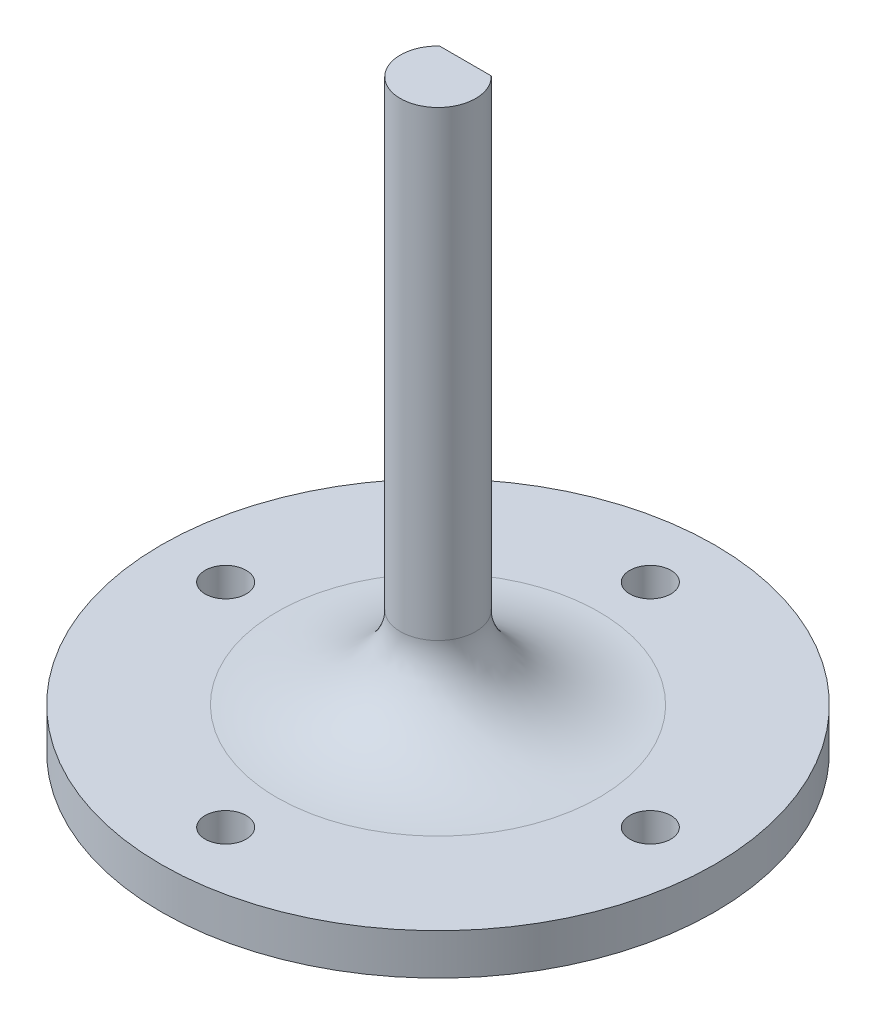
ISO-10303-21;
HEADER;
FILE_DESCRIPTION(('STEP AP214'),'2;1');
FILE_NAME('part.step','',(''),(''),'','','');
FILE_SCHEMA(('AUTOMOTIVE_DESIGN { 1 0 10303 214 1 1 1 1 }'));
ENDSEC;
DATA;
#1=APPLICATION_CONTEXT('core data for automotive mechanical design processes');
#2=APPLICATION_PROTOCOL_DEFINITION('international standard','automotive_design',2000,#1);
#3=PRODUCT_CONTEXT('',#1,'mechanical');
#4=PRODUCT('Part','Part','',(#3));
#5=PRODUCT_RELATED_PRODUCT_CATEGORY('part','',(#4));
#6=PRODUCT_DEFINITION_FORMATION('','',#4);
#7=PRODUCT_DEFINITION_CONTEXT('part definition',#1,'design');
#8=PRODUCT_DEFINITION('design','',#6,#7);
#9=PRODUCT_DEFINITION_SHAPE('','',#8);
#10=(LENGTH_UNIT() NAMED_UNIT(*) SI_UNIT(.MILLI.,.METRE.));
#11=(NAMED_UNIT(*) PLANE_ANGLE_UNIT() SI_UNIT($,.RADIAN.));
#12=(NAMED_UNIT(*) SI_UNIT($,.STERADIAN.) SOLID_ANGLE_UNIT());
#13=UNCERTAINTY_MEASURE_WITH_UNIT(LENGTH_MEASURE(1.E-05),#10,'distance_accuracy_value','');
#14=(GEOMETRIC_REPRESENTATION_CONTEXT(3) GLOBAL_UNCERTAINTY_ASSIGNED_CONTEXT((#13)) GLOBAL_UNIT_ASSIGNED_CONTEXT((#10,
#11,#12)) REPRESENTATION_CONTEXT('',''));
#15=CARTESIAN_POINT('',(0.,0.,0.));
#16=DIRECTION('',(0.,0.,1.));
#17=DIRECTION('',(1.,0.,0.));
#18=AXIS2_PLACEMENT_3D('',#15,#16,#17);
#19=CARTESIAN_POINT('',(0.,0.,0.));
#20=DIRECTION('',(0.,1.,0.));
#21=DIRECTION('',(0.,0.,1.));
#22=AXIS2_PLACEMENT_3D('',#19,#20,#21);
#23=PLANE('',#22);
#24=CARTESIAN_POINT('',(0.,0.,11.75));
#25=CARTESIAN_POINT('',(1.53807140146181,0.,11.75));
#26=CARTESIAN_POINT('',(3.07553764293737,0.,11.4441789501425));
#27=CARTESIAN_POINT('',(5.91752301764225,0.,10.2669900638728));
#28=CARTESIAN_POINT('',(7.22092396101885,0.,9.39608539686501));
#29=CARTESIAN_POINT('',(9.39608539686501,0.,7.22092396101885));
#30=CARTESIAN_POINT('',(10.2669900638731,0.,5.91752301764265));
#31=CARTESIAN_POINT('',(11.4441789501421,0.,3.07553764293695));
#32=CARTESIAN_POINT('',(11.75,0.,1.53807140146327));
#33=CARTESIAN_POINT('',(11.75,0.,-1.53807140146327));
#34=CARTESIAN_POINT('',(11.4441789501421,0.,-3.0755376429363));
#35=CARTESIAN_POINT('',(10.2669900638731,0.,-5.91752301764332));
#36=CARTESIAN_POINT('',(9.39608539686634,0.,-7.22092396101886));
#37=CARTESIAN_POINT('',(7.22092396101751,0.,-9.39608539686502));
#38=CARTESIAN_POINT('',(5.91752301764267,0.,-10.2669900638731));
#39=CARTESIAN_POINT('',(3.07553764293697,0.,-11.4441789501421));
#40=CARTESIAN_POINT('',(1.53807140146327,0.,-11.75));
#41=CARTESIAN_POINT('',(-1.53807140146327,0.,-11.75));
#42=CARTESIAN_POINT('',(-3.07553764293761,0.,-11.4441789501421));
#43=CARTESIAN_POINT('',(-5.91752301764197,0.,-10.2669900638732));
#44=CARTESIAN_POINT('',(-7.22092396101752,0.,-9.39608539686634));
#45=CARTESIAN_POINT('',(-9.39608539686635,0.,-7.22092396101751));
#46=CARTESIAN_POINT('',(-10.2669900638727,0.,-5.91752301764274));
#47=CARTESIAN_POINT('',(-11.4441789501425,0.,-3.07553764293689));
#48=CARTESIAN_POINT('',(-11.75,0.,-1.53807140146325));
#49=CARTESIAN_POINT('',(-11.75,0.,1.53807140146329));
#50=CARTESIAN_POINT('',(-11.4441789501425,0.,3.07553764293686));
#51=CARTESIAN_POINT('',(-10.2669900638727,0.,5.91752301764271));
#52=CARTESIAN_POINT('',(-9.39608539686538,0.,7.22092396101716));
#53=CARTESIAN_POINT('',(-7.22092396101854,0.,9.39608539686666));
#54=CARTESIAN_POINT('',(-5.91752301764275,0.,10.2669900638727));
#55=CARTESIAN_POINT('',(-3.0755376429369,0.,11.4441789501425));
#56=CARTESIAN_POINT('',(-1.53807140146181,0.,11.75));
#57=CARTESIAN_POINT('',(0.,0.,11.75));
#58=(BOUNDED_CURVE() B_SPLINE_CURVE(3,(#24,#25,#26,#27,#28,#29,#30,#31,#32,#33,#34,#35,#36,#37,
#38,#39,#40,#41,#42,#43,#44,#45,#46,#47,#48,#49,#50,#51,#52,#53,#54,#55,#56,#57),.UNSPECIFIED.,
.T.,.F.) B_SPLINE_CURVE_WITH_KNOTS((4,2,2,2,2,2,2,2,2,2,2,2,2,2,2,2,4),(0.,0.392699081698724,
0.785398163397448,1.17809724509617,1.5707963267949,1.96349540849362,2.35619449019234,
2.74889357189107,3.14159265358979,3.53429173528852,3.92699081698724,4.31968989868597,
4.71238898038469,5.10508806208341,5.49778714378214,5.89048622548086,6.28318530717959),
.UNSPECIFIED.) CURVE() GEOMETRIC_REPRESENTATION_ITEM() RATIONAL_B_SPLINE_CURVE((1.,1.,1.,1.,1.,
1.,1.,1.,1.,1.,1.,1.,1.,1.,1.,1.,1.,1.,1.,1.,1.,1.,1.,1.,1.,1.,1.,1.,1.,1.,1.,1.,1.,1.)) REPRESENTATION_ITEM(''));
#59=CARTESIAN_POINT('',(0.,0.,11.75));
#60=VERTEX_POINT('',#59);
#61=EDGE_CURVE('E12',#60,#60,#58,.F.);
#62=ORIENTED_EDGE('',*,*,#61,.T.);
#63=EDGE_LOOP('',(#62));
#64=FACE_BOUND('',#63,.T.);
#65=CARTESIAN_POINT('',(0.,0.,0.));
#66=DIRECTION('',(0.,1.,0.));
#67=DIRECTION('',(0.,0.,1.));
#68=AXIS2_PLACEMENT_3D('',#65,#66,#67);
#69=CIRCLE('',#68,20.2034466491186);
#70=CARTESIAN_POINT('',(0.,0.,20.2034466491186));
#71=VERTEX_POINT('',#70);
#72=EDGE_CURVE('E190',#71,#71,#69,.T.);
#73=ORIENTED_EDGE('',*,*,#72,.T.);
#74=EDGE_LOOP('',(#73));
#75=FACE_BOUND('',#74,.T.);
#76=CARTESIAN_POINT('',(15.5,0.,0.));
#77=DIRECTION('',(0.,1.,0.));
#78=DIRECTION('',(0.,0.,1.));
#79=AXIS2_PLACEMENT_3D('',#76,#77,#78);
#80=CIRCLE('',#79,1.5);
#81=CARTESIAN_POINT('',(15.5,0.,1.5));
#82=VERTEX_POINT('',#81);
#83=EDGE_CURVE('E188',#82,#82,#80,.T.);
#84=ORIENTED_EDGE('',*,*,#83,.F.);
#85=EDGE_LOOP('',(#84));
#86=FACE_BOUND('',#85,.T.);
#87=CARTESIAN_POINT('',(0.,0.,15.5));
#88=DIRECTION('',(0.,1.,0.));
#89=DIRECTION('',(0.,0.,1.));
#90=AXIS2_PLACEMENT_3D('',#87,#88,#89);
#91=CIRCLE('',#90,1.5);
#92=CARTESIAN_POINT('',(0.,0.,17.));
#93=VERTEX_POINT('',#92);
#94=EDGE_CURVE('E180',#93,#93,#91,.T.);
#95=ORIENTED_EDGE('',*,*,#94,.F.);
#96=EDGE_LOOP('',(#95));
#97=FACE_BOUND('',#96,.T.);
#98=CARTESIAN_POINT('',(-15.5,0.,0.));
#99=DIRECTION('',(0.,1.,0.));
#100=DIRECTION('',(0.,0.,1.));
#101=AXIS2_PLACEMENT_3D('',#98,#99,#100);
#102=CIRCLE('',#101,1.5);
#103=CARTESIAN_POINT('',(-15.5,0.,1.5));
#104=VERTEX_POINT('',#103);
#105=EDGE_CURVE('E177',#104,#104,#102,.T.);
#106=ORIENTED_EDGE('',*,*,#105,.F.);
#107=EDGE_LOOP('',(#106));
#108=FACE_BOUND('',#107,.T.);
#109=CARTESIAN_POINT('',(0.,0.,-15.5));
#110=DIRECTION('',(0.,1.,0.));
#111=DIRECTION('',(0.,0.,1.));
#112=AXIS2_PLACEMENT_3D('',#109,#110,#111);
#113=CIRCLE('',#112,1.5);
#114=CARTESIAN_POINT('',(0.,0.,-14.));
#115=VERTEX_POINT('',#114);
#116=EDGE_CURVE('E175',#115,#115,#113,.T.);
#117=ORIENTED_EDGE('',*,*,#116,.F.);
#118=EDGE_LOOP('',(#117));
#119=FACE_BOUND('',#118,.T.);
#120=ADVANCED_FACE('F50',(#64,#75,#86,#97,#108,#119),#23,.T.);
#121=CARTESIAN_POINT('',(15.5,-3.,0.));
#122=DIRECTION('',(0.,1.,0.));
#123=DIRECTION('',(0.,0.,1.));
#124=AXIS2_PLACEMENT_3D('',#121,#122,#123);
#125=CYLINDRICAL_SURFACE('',#124,1.5);
#126=CARTESIAN_POINT('',(15.5,-3.,0.));
#127=DIRECTION('',(0.,1.,0.));
#128=DIRECTION('',(0.,0.,1.));
#129=AXIS2_PLACEMENT_3D('',#126,#127,#128);
#130=CIRCLE('',#129,1.5);
#131=CARTESIAN_POINT('',(15.5,-3.,1.5));
#132=VERTEX_POINT('',#131);
#133=EDGE_CURVE('E203',#132,#132,#130,.T.);
#134=ORIENTED_EDGE('',*,*,#133,.F.);
#135=EDGE_LOOP('',(#134));
#136=FACE_BOUND('',#135,.T.);
#137=ORIENTED_EDGE('',*,*,#83,.T.);
#138=EDGE_LOOP('',(#137));
#139=FACE_BOUND('',#138,.T.);
#140=ADVANCED_FACE('F147',(#136,#139),#125,.F.);
#141=CARTESIAN_POINT('',(0.,-3.,15.5));
#142=DIRECTION('',(0.,1.,0.));
#143=DIRECTION('',(0.,0.,1.));
#144=AXIS2_PLACEMENT_3D('',#141,#142,#143);
#145=CYLINDRICAL_SURFACE('',#144,1.5);
#146=CARTESIAN_POINT('',(0.,-3.,15.5));
#147=DIRECTION('',(0.,1.,0.));
#148=DIRECTION('',(0.,0.,1.));
#149=AXIS2_PLACEMENT_3D('',#146,#147,#148);
#150=CIRCLE('',#149,1.5);
#151=CARTESIAN_POINT('',(0.,-3.,17.));
#152=VERTEX_POINT('',#151);
#153=EDGE_CURVE('E197',#152,#152,#150,.T.);
#154=ORIENTED_EDGE('',*,*,#153,.F.);
#155=EDGE_LOOP('',(#154));
#156=FACE_BOUND('',#155,.T.);
#157=ORIENTED_EDGE('',*,*,#94,.T.);
#158=EDGE_LOOP('',(#157));
#159=FACE_BOUND('',#158,.T.);
#160=ADVANCED_FACE('F157',(#156,#159),#145,.F.);
#161=CARTESIAN_POINT('',(-15.5,-3.,0.));
#162=DIRECTION('',(0.,1.,0.));
#163=DIRECTION('',(0.,0.,1.));
#164=AXIS2_PLACEMENT_3D('',#161,#162,#163);
#165=CYLINDRICAL_SURFACE('',#164,1.5);
#166=CARTESIAN_POINT('',(-15.5,-3.,0.));
#167=DIRECTION('',(0.,1.,0.));
#168=DIRECTION('',(0.,0.,1.));
#169=AXIS2_PLACEMENT_3D('',#166,#167,#168);
#170=CIRCLE('',#169,1.5);
#171=CARTESIAN_POINT('',(-15.5,-3.,1.5));
#172=VERTEX_POINT('',#171);
#173=EDGE_CURVE('E193',#172,#172,#170,.T.);
#174=ORIENTED_EDGE('',*,*,#173,.F.);
#175=EDGE_LOOP('',(#174));
#176=FACE_BOUND('',#175,.T.);
#177=ORIENTED_EDGE('',*,*,#105,.T.);
#178=EDGE_LOOP('',(#177));
#179=FACE_BOUND('',#178,.T.);
#180=ADVANCED_FACE('F161',(#176,#179),#165,.F.);
#181=CARTESIAN_POINT('',(0.,-3.,-15.5));
#182=DIRECTION('',(0.,1.,0.));
#183=DIRECTION('',(0.,0.,1.));
#184=AXIS2_PLACEMENT_3D('',#181,#182,#183);
#185=CYLINDRICAL_SURFACE('',#184,1.5);
#186=CARTESIAN_POINT('',(0.,-3.,-15.5));
#187=DIRECTION('',(0.,1.,0.));
#188=DIRECTION('',(0.,0.,1.));
#189=AXIS2_PLACEMENT_3D('',#186,#187,#188);
#190=CIRCLE('',#189,1.5);
#191=CARTESIAN_POINT('',(0.,-3.,-14.));
#192=VERTEX_POINT('',#191);
#193=EDGE_CURVE('E172',#192,#192,#190,.T.);
#194=ORIENTED_EDGE('',*,*,#193,.F.);
#195=EDGE_LOOP('',(#194));
#196=FACE_BOUND('',#195,.T.);
#197=ORIENTED_EDGE('',*,*,#116,.T.);
#198=EDGE_LOOP('',(#197));
#199=FACE_BOUND('',#198,.T.);
#200=ADVANCED_FACE('F153',(#196,#199),#185,.F.);
#201=CARTESIAN_POINT('',(0.,-3.,0.));
#202=DIRECTION('',(0.,1.,0.));
#203=DIRECTION('',(0.,0.,1.));
#204=AXIS2_PLACEMENT_3D('',#201,#202,#203);
#205=CYLINDRICAL_SURFACE('',#204,20.2034466491186);
#206=CARTESIAN_POINT('',(0.,-3.,0.));
#207=DIRECTION('',(0.,1.,0.));
#208=DIRECTION('',(0.,0.,1.));
#209=AXIS2_PLACEMENT_3D('',#206,#207,#208);
#210=CIRCLE('',#209,20.2034466491186);
#211=CARTESIAN_POINT('',(0.,-3.,20.2034466491186));
#212=VERTEX_POINT('',#211);
#213=EDGE_CURVE('E95',#212,#212,#210,.T.);
#214=ORIENTED_EDGE('',*,*,#213,.T.);
#215=EDGE_LOOP('',(#214));
#216=FACE_BOUND('',#215,.T.);
#217=ORIENTED_EDGE('',*,*,#72,.F.);
#218=EDGE_LOOP('',(#217));
#219=FACE_BOUND('',#218,.T.);
#220=ADVANCED_FACE('F150',(#216,#219),#205,.T.);
#221=CARTESIAN_POINT('',(0.,-3.,0.));
#222=DIRECTION('',(0.,1.,0.));
#223=DIRECTION('',(0.,0.,1.));
#224=AXIS2_PLACEMENT_3D('',#221,#222,#223);
#225=PLANE('',#224);
#226=ORIENTED_EDGE('',*,*,#193,.T.);
#227=EDGE_LOOP('',(#226));
#228=FACE_BOUND('',#227,.T.);
#229=ORIENTED_EDGE('',*,*,#173,.T.);
#230=EDGE_LOOP('',(#229));
#231=FACE_BOUND('',#230,.T.);
#232=ORIENTED_EDGE('',*,*,#153,.T.);
#233=EDGE_LOOP('',(#232));
#234=FACE_BOUND('',#233,.T.);
#235=ORIENTED_EDGE('',*,*,#133,.T.);
#236=EDGE_LOOP('',(#235));
#237=FACE_BOUND('',#236,.T.);
#238=ORIENTED_EDGE('',*,*,#213,.F.);
#239=EDGE_LOOP('',(#238));
#240=FACE_BOUND('',#239,.T.);
#241=ADVANCED_FACE('F148',(#228,#231,#234,#237,#240),#225,.F.);
#242=CARTESIAN_POINT('',(0.,39.7,-2.));
#243=DIRECTION('',(0.,0.,-1.));
#244=DIRECTION('',(-1.,0.,0.));
#245=AXIS2_PLACEMENT_3D('',#242,#243,#244);
#246=PLANE('',#245);
#247=DIRECTION('',(1.,0.,0.));
#248=VECTOR('',#247,1.);
#249=CARTESIAN_POINT('',(0.,6.,-2.));
#250=LINE('',#249,#248);
#251=CARTESIAN_POINT('',(-1.8874543047879,6.,-1.99999543402184));
#252=VERTEX_POINT('',#251);
#253=CARTESIAN_POINT('',(1.8874543047879,6.,-1.99999543402184));
#254=VERTEX_POINT('',#253);
#255=EDGE_CURVE('E99',#252,#254,#250,.T.);
#256=ORIENTED_EDGE('',*,*,#255,.F.);
#257=DIRECTION('',(0.,-1.,0.));
#258=VECTOR('',#257,1.);
#259=CARTESIAN_POINT('',(-1.88745860881769,39.7,-2.));
#260=LINE('',#259,#258);
#261=CARTESIAN_POINT('',(-1.88745860881769,39.7,-2.));
#262=VERTEX_POINT('',#261);
#263=EDGE_CURVE('E79',#262,#252,#260,.T.);
#264=ORIENTED_EDGE('',*,*,#263,.F.);
#265=DIRECTION('',(1.,0.,0.));
#266=VECTOR('',#265,1.);
#267=CARTESIAN_POINT('',(0.,39.7,-2.));
#268=LINE('',#267,#266);
#269=CARTESIAN_POINT('',(1.88745860881769,39.7,-2.));
#270=VERTEX_POINT('',#269);
#271=EDGE_CURVE('E104',#262,#270,#268,.T.);
#272=ORIENTED_EDGE('',*,*,#271,.T.);
#273=DIRECTION('',(0.,-1.,0.));
#274=VECTOR('',#273,1.);
#275=CARTESIAN_POINT('',(1.88745860881769,39.7,-2.));
#276=LINE('',#275,#274);
#277=EDGE_CURVE('E90',#270,#254,#276,.T.);
#278=ORIENTED_EDGE('',*,*,#277,.T.);
#279=EDGE_LOOP('',(#256,#264,#272,#278));
#280=FACE_BOUND('',#279,.T.);
#281=ADVANCED_FACE('F103',(#280),#246,.T.);
#282=CARTESIAN_POINT('',(0.,39.7,0.));
#283=DIRECTION('',(0.,-1.,0.));
#284=DIRECTION('',(0.,0.,-1.));
#285=AXIS2_PLACEMENT_3D('',#282,#283,#284);
#286=CYLINDRICAL_SURFACE('',#285,2.75);
#287=ORIENTED_EDGE('',*,*,#263,.T.);
#288=CARTESIAN_POINT('',(0.,6.,2.75));
#289=CARTESIAN_POINT('',(-0.359974157788935,6.,2.75));
#290=CARTESIAN_POINT('',(-0.719806682389404,6.,2.67842486067161));
#291=CARTESIAN_POINT('',(-1.3849521956186,6.,2.40291256814047));
#292=CARTESIAN_POINT('',(-1.69000348023811,6.,2.19908381628791));
#293=CARTESIAN_POINT('',(-2.19908381628792,6.,1.69000348023809));
#294=CARTESIAN_POINT('',(-2.40291256814027,6.,1.38495219561906));
#295=CARTESIAN_POINT('',(-2.67842486067181,6.,0.719806682388923));
#296=CARTESIAN_POINT('',(-2.75,6.,0.359974157789281));
#297=CARTESIAN_POINT('',(-2.75,6.,-0.359974157789272));
#298=CARTESIAN_POINT('',(-2.67842486067161,6.,-0.719806682389403));
#299=CARTESIAN_POINT('',(-2.40291256814046,6.,-1.3849521956186));
#300=CARTESIAN_POINT('',(-2.19908381628759,6.,-1.69000348023843));
#301=CARTESIAN_POINT('',(-1.69000348023843,6.,-2.19908381628758));
#302=CARTESIAN_POINT('',(-1.38495219561856,6.,-2.40291256814048));
#303=CARTESIAN_POINT('',(-0.719806682389431,6.,-2.6784248606716));
#304=CARTESIAN_POINT('',(-0.359974157789276,6.,-2.75));
#305=CARTESIAN_POINT('',(0.359974157789276,6.,-2.75));
#306=CARTESIAN_POINT('',(0.719806682389343,6.,-2.67842486067164));
#307=CARTESIAN_POINT('',(1.38495219561866,6.,-2.40291256814044));
#308=CARTESIAN_POINT('',(1.69000348023809,6.,-2.19908381628792));
#309=CARTESIAN_POINT('',(2.19908381628792,6.,-1.6900034802381));
#310=CARTESIAN_POINT('',(2.40291256814055,6.,-1.38495219561838));
#311=CARTESIAN_POINT('',(2.67842486067152,6.,-0.719806682389614));
#312=CARTESIAN_POINT('',(2.75,6.,-0.359974157789276));
#313=CARTESIAN_POINT('',(2.75,6.,0.359974157789276));
#314=CARTESIAN_POINT('',(2.67842486067187,6.,0.719806682388767));
#315=CARTESIAN_POINT('',(2.40291256814021,6.,1.38495219561923));
#316=CARTESIAN_POINT('',(2.19908381628759,6.,1.69000348023843));
#317=CARTESIAN_POINT('',(1.69000348023843,6.,2.19908381628759));
#318=CARTESIAN_POINT('',(1.38495219561859,6.,2.40291256814047));
#319=CARTESIAN_POINT('',(0.719806682389405,6.,2.67842486067161));
#320=CARTESIAN_POINT('',(0.359974157788935,6.,2.75));
#321=CARTESIAN_POINT('',(0.,6.,2.75));
#322=(BOUNDED_CURVE() B_SPLINE_CURVE(3,(#288,#289,#290,#291,#292,#293,#294,#295,#296,#297,#298,
#299,#300,#301,#302,#303,#304,#305,#306,#307,#308,#309,#310,#311,#312,#313,#314,#315,#316,#317,
#318,#319,#320,#321),.UNSPECIFIED.,.T.,.F.) B_SPLINE_CURVE_WITH_KNOTS((4,2,2,2,2,2,2,2,2,2,2,2,
2,2,2,2,4),(0.,0.392699081698725,0.785398163397448,1.17809724509617,1.5707963267949,
1.96349540849362,2.35619449019234,2.74889357189107,3.14159265358979,3.53429173528852,
3.92699081698724,4.31968989868597,4.71238898038469,5.10508806208341,5.49778714378214,
5.89048622548086,6.28318530717959),
.UNSPECIFIED.) CURVE() GEOMETRIC_REPRESENTATION_ITEM() RATIONAL_B_SPLINE_CURVE((1.,1.,1.,1.,1.,
1.,1.,1.,1.,1.,1.,1.,1.,1.,1.,1.,1.,1.,1.,1.,1.,1.,1.,1.,1.,1.,1.,1.,1.,1.,1.,1.,1.,1.)) REPRESENTATION_ITEM(''));
#323=EDGE_CURVE('E65',#252,#254,#322,.F.);
#324=ORIENTED_EDGE('',*,*,#323,.T.);
#325=ORIENTED_EDGE('',*,*,#277,.F.);
#326=CARTESIAN_POINT('',(0.,39.7,0.));
#327=DIRECTION('',(0.,1.,0.));
#328=DIRECTION('',(0.,0.,1.));
#329=AXIS2_PLACEMENT_3D('',#326,#327,#328);
#330=CIRCLE('',#329,2.75);
#331=EDGE_CURVE('E71',#262,#270,#330,.T.);
#332=ORIENTED_EDGE('',*,*,#331,.F.);
#333=EDGE_LOOP('',(#287,#324,#325,#332));
#334=FACE_BOUND('',#333,.T.);
#335=ADVANCED_FACE('F88',(#334),#286,.T.);
#336=CARTESIAN_POINT('',(0.,39.7,0.));
#337=DIRECTION('',(0.,1.,0.));
#338=DIRECTION('',(0.,0.,1.));
#339=AXIS2_PLACEMENT_3D('',#336,#337,#338);
#340=PLANE('',#339);
#341=ORIENTED_EDGE('',*,*,#271,.F.);
#342=ORIENTED_EDGE('',*,*,#331,.T.);
#343=EDGE_LOOP('',(#341,#342));
#344=FACE_BOUND('',#343,.T.);
#345=ADVANCED_FACE('F229',(#344),#340,.T.);
#346=CARTESIAN_POINT('',(0.,6.,0.));
#347=DIRECTION('',(0.,1.,0.));
#348=DIRECTION('',(0.,0.,1.));
#349=AXIS2_PLACEMENT_3D('',#346,#347,#348);
#350=PLANE('',#349);
#351=ORIENTED_EDGE('',*,*,#255,.T.);
#352=CARTESIAN_POINT('',(0.,6.,2.75));
#353=CARTESIAN_POINT('',(-0.359974157788935,6.,2.75));
#354=CARTESIAN_POINT('',(-0.719806682389404,6.,2.67842486067161));
#355=CARTESIAN_POINT('',(-1.3849521956186,6.,2.40291256814047));
#356=CARTESIAN_POINT('',(-1.69000348023811,6.,2.19908381628791));
#357=CARTESIAN_POINT('',(-2.19908381628792,6.,1.69000348023809));
#358=CARTESIAN_POINT('',(-2.40291256814027,6.,1.38495219561906));
#359=CARTESIAN_POINT('',(-2.67842486067181,6.,0.719806682388923));
#360=CARTESIAN_POINT('',(-2.75,6.,0.359974157789281));
#361=CARTESIAN_POINT('',(-2.75,6.,-0.359974157789272));
#362=CARTESIAN_POINT('',(-2.67842486067161,6.,-0.719806682389403));
#363=CARTESIAN_POINT('',(-2.40291256814046,6.,-1.3849521956186));
#364=CARTESIAN_POINT('',(-2.19908381628759,6.,-1.69000348023843));
#365=CARTESIAN_POINT('',(-1.69000348023843,6.,-2.19908381628758));
#366=CARTESIAN_POINT('',(-1.38495219561856,6.,-2.40291256814048));
#367=CARTESIAN_POINT('',(-0.719806682389431,6.,-2.6784248606716));
#368=CARTESIAN_POINT('',(-0.359974157789276,6.,-2.75));
#369=CARTESIAN_POINT('',(0.359974157789276,6.,-2.75));
#370=CARTESIAN_POINT('',(0.719806682389343,6.,-2.67842486067164));
#371=CARTESIAN_POINT('',(1.38495219561866,6.,-2.40291256814044));
#372=CARTESIAN_POINT('',(1.69000348023809,6.,-2.19908381628792));
#373=CARTESIAN_POINT('',(2.19908381628792,6.,-1.6900034802381));
#374=CARTESIAN_POINT('',(2.40291256814055,6.,-1.38495219561838));
#375=CARTESIAN_POINT('',(2.67842486067152,6.,-0.719806682389614));
#376=CARTESIAN_POINT('',(2.75,6.,-0.359974157789276));
#377=CARTESIAN_POINT('',(2.75,6.,0.359974157789276));
#378=CARTESIAN_POINT('',(2.67842486067187,6.,0.719806682388767));
#379=CARTESIAN_POINT('',(2.40291256814021,6.,1.38495219561923));
#380=CARTESIAN_POINT('',(2.19908381628759,6.,1.69000348023843));
#381=CARTESIAN_POINT('',(1.69000348023843,6.,2.19908381628759));
#382=CARTESIAN_POINT('',(1.38495219561859,6.,2.40291256814047));
#383=CARTESIAN_POINT('',(0.719806682389405,6.,2.67842486067161));
#384=CARTESIAN_POINT('',(0.359974157788935,6.,2.75));
#385=CARTESIAN_POINT('',(0.,6.,2.75));
#386=(BOUNDED_CURVE() B_SPLINE_CURVE(3,(#352,#353,#354,#355,#356,#357,#358,#359,#360,#361,#362,
#363,#364,#365,#366,#367,#368,#369,#370,#371,#372,#373,#374,#375,#376,#377,#378,#379,#380,#381,
#382,#383,#384,#385),.UNSPECIFIED.,.T.,.F.) B_SPLINE_CURVE_WITH_KNOTS((4,2,2,2,2,2,2,2,2,2,2,2,
2,2,2,2,4),(0.,0.392699081698725,0.785398163397448,1.17809724509617,1.5707963267949,
1.96349540849362,2.35619449019234,2.74889357189107,3.14159265358979,3.53429173528852,
3.92699081698724,4.31968989868597,4.71238898038469,5.10508806208341,5.49778714378214,
5.89048622548086,6.28318530717959),
.UNSPECIFIED.) CURVE() GEOMETRIC_REPRESENTATION_ITEM() RATIONAL_B_SPLINE_CURVE((1.,1.,1.,1.,1.,
1.,1.,1.,1.,1.,1.,1.,1.,1.,1.,1.,1.,1.,1.,1.,1.,1.,1.,1.,1.,1.,1.,1.,1.,1.,1.,1.,1.,1.)) REPRESENTATION_ITEM(''));
#387=EDGE_CURVE('E101',#254,#252,#386,.F.);
#388=ORIENTED_EDGE('',*,*,#387,.T.);
#389=EDGE_LOOP('',(#351,#388));
#390=FACE_BOUND('',#389,.T.);
#391=ADVANCED_FACE('F100',(#390),#350,.T.);
#392=CARTESIAN_POINT('',(0.,6.,2.75));
#393=CARTESIAN_POINT('',(0.359974157788935,6.,2.75));
#394=CARTESIAN_POINT('',(0.719806682389405,6.,2.67842486067161));
#395=CARTESIAN_POINT('',(1.38495219561859,6.,2.40291256814047));
#396=CARTESIAN_POINT('',(1.69000348023843,6.,2.19908381628759));
#397=CARTESIAN_POINT('',(2.19908381628759,6.,1.69000348023843));
#398=CARTESIAN_POINT('',(2.40291256814021,6.,1.38495219561923));
#399=CARTESIAN_POINT('',(2.67842486067187,6.,0.719806682388767));
#400=CARTESIAN_POINT('',(2.75,6.,0.359974157789276));
#401=CARTESIAN_POINT('',(2.75,6.,-0.359974157789276));
#402=CARTESIAN_POINT('',(2.67842486067152,6.,-0.719806682389614));
#403=CARTESIAN_POINT('',(2.40291256814055,6.,-1.38495219561838));
#404=CARTESIAN_POINT('',(2.19908381628792,6.,-1.6900034802381));
#405=CARTESIAN_POINT('',(1.69000348023809,6.,-2.19908381628792));
#406=CARTESIAN_POINT('',(1.38495219561866,6.,-2.40291256814044));
#407=CARTESIAN_POINT('',(0.719806682389343,6.,-2.67842486067164));
#408=CARTESIAN_POINT('',(0.359974157789276,6.,-2.75));
#409=CARTESIAN_POINT('',(-0.359974157789276,6.,-2.75));
#410=CARTESIAN_POINT('',(-0.719806682389431,6.,-2.6784248606716));
#411=CARTESIAN_POINT('',(-1.38495219561856,6.,-2.40291256814048));
#412=CARTESIAN_POINT('',(-1.69000348023843,6.,-2.19908381628758));
#413=CARTESIAN_POINT('',(-2.19908381628759,6.,-1.69000348023843));
#414=CARTESIAN_POINT('',(-2.40291256814046,6.,-1.3849521956186));
#415=CARTESIAN_POINT('',(-2.67842486067161,6.,-0.719806682389403));
#416=CARTESIAN_POINT('',(-2.75,6.,-0.359974157789272));
#417=CARTESIAN_POINT('',(-2.75,6.,0.359974157789281));
#418=CARTESIAN_POINT('',(-2.67842486067181,6.,0.719806682388923));
#419=CARTESIAN_POINT('',(-2.40291256814027,6.,1.38495219561906));
#420=CARTESIAN_POINT('',(-2.19908381628792,6.,1.69000348023809));
#421=CARTESIAN_POINT('',(-1.69000348023811,6.,2.19908381628791));
#422=CARTESIAN_POINT('',(-1.3849521956186,6.,2.40291256814047));
#423=CARTESIAN_POINT('',(-0.719806682389404,6.,2.67842486067161));
#424=CARTESIAN_POINT('',(-0.359974157788935,6.,2.75));
#425=CARTESIAN_POINT('',(0.,6.,2.75));
#426=CARTESIAN_POINT('',(0.,0.,2.75));
#427=CARTESIAN_POINT('',(0.359974157788935,0.,2.75));
#428=CARTESIAN_POINT('',(0.719806682389944,0.,2.67842486067371));
#429=CARTESIAN_POINT('',(1.38495219561805,0.,2.40291256813836));
#430=CARTESIAN_POINT('',(1.69000348023776,6.65297419290677E-13,2.19908381628825));
#431=CARTESIAN_POINT('',(2.19908381628825,-6.6876686624263E-13,1.69000348023776));
#432=CARTESIAN_POINT('',(2.40291256813845,2.00196379003795E-12,1.3849521956195));
#433=CARTESIAN_POINT('',(2.67842486067363,-2.00022906656197E-12,0.719806682388494));
#434=CARTESIAN_POINT('',(2.75,0.,0.359974157789276));
#435=CARTESIAN_POINT('',(2.75,0.,-0.359974157789276));
#436=CARTESIAN_POINT('',(2.67842486066962,1.99936170482398E-12,-0.719806682388827));
#437=CARTESIAN_POINT('',(2.40291256814245,-2.00283115177594E-12,-1.38495219561917));
#438=CARTESIAN_POINT('',(2.19908381629025,0.,-1.69000348024043));
#439=CARTESIAN_POINT('',(1.69000348023576,0.,-2.19908381628559));
#440=CARTESIAN_POINT('',(1.38495219561717,-6.6876686624263E-13,-2.40291256813712));
#441=CARTESIAN_POINT('',(0.719806682390833,6.65297419290677E-13,-2.67842486067496));
#442=CARTESIAN_POINT('',(0.359974157789276,0.,-2.75));
#443=CARTESIAN_POINT('',(-0.359974157789276,0.,-2.75));
#444=CARTESIAN_POINT('',(-0.719806682391159,0.,-2.67842486067496));
#445=CARTESIAN_POINT('',(-1.38495219561683,0.,-2.40291256813712));
#446=CARTESIAN_POINT('',(-1.6900034802391,0.,-2.19908381628825));
#447=CARTESIAN_POINT('',(-2.19908381628692,0.,-1.69000348023776));
#448=CARTESIAN_POINT('',(-2.40291256813906,0.,-1.38495219561757));
#449=CARTESIAN_POINT('',(-2.67842486067301,0.,-0.71980668239043));
#450=CARTESIAN_POINT('',(-2.75,0.,-0.359974157789272));
#451=CARTESIAN_POINT('',(-2.75,0.,0.359974157789281));
#452=CARTESIAN_POINT('',(-2.67842486067302,0.,0.719806682389756));
#453=CARTESIAN_POINT('',(-2.40291256813907,0.,1.38495219561823));
#454=CARTESIAN_POINT('',(-2.19908381628625,0.,1.69000348023576));
#455=CARTESIAN_POINT('',(-1.69000348023978,0.,2.19908381629024));
#456=CARTESIAN_POINT('',(-1.38495219561757,0.,2.40291256813907));
#457=CARTESIAN_POINT('',(-0.719806682390431,0.,2.67842486067301));
#458=CARTESIAN_POINT('',(-0.359974157788935,0.,2.75));
#459=CARTESIAN_POINT('',(0.,0.,2.75));
#460=CARTESIAN_POINT('',(0.,0.,11.75));
#461=CARTESIAN_POINT('',(1.53807140146181,0.,11.75));
#462=CARTESIAN_POINT('',(3.07553764293737,0.,11.4441789501425));
#463=CARTESIAN_POINT('',(5.91752301764225,0.,10.2669900638728));
#464=CARTESIAN_POINT('',(7.22092396101885,0.,9.39608539686501));
#465=CARTESIAN_POINT('',(9.39608539686501,0.,7.22092396101885));
#466=CARTESIAN_POINT('',(10.2669900638731,0.,5.91752301764265));
#467=CARTESIAN_POINT('',(11.4441789501421,0.,3.07553764293695));
#468=CARTESIAN_POINT('',(11.75,0.,1.53807140146327));
#469=CARTESIAN_POINT('',(11.75,0.,-1.53807140146327));
#470=CARTESIAN_POINT('',(11.4441789501421,0.,-3.0755376429363));
#471=CARTESIAN_POINT('',(10.2669900638731,0.,-5.91752301764332));
#472=CARTESIAN_POINT('',(9.39608539686634,0.,-7.22092396101886));
#473=CARTESIAN_POINT('',(7.22092396101751,0.,-9.39608539686502));
#474=CARTESIAN_POINT('',(5.91752301764267,0.,-10.2669900638731));
#475=CARTESIAN_POINT('',(3.07553764293697,0.,-11.4441789501421));
#476=CARTESIAN_POINT('',(1.53807140146327,0.,-11.75));
#477=CARTESIAN_POINT('',(-1.53807140146327,0.,-11.75));
#478=CARTESIAN_POINT('',(-3.07553764293761,0.,-11.4441789501421));
#479=CARTESIAN_POINT('',(-5.91752301764197,0.,-10.2669900638732));
#480=CARTESIAN_POINT('',(-7.22092396101752,0.,-9.39608539686634));
#481=CARTESIAN_POINT('',(-9.39608539686635,0.,-7.22092396101751));
#482=CARTESIAN_POINT('',(-10.2669900638727,0.,-5.91752301764274));
#483=CARTESIAN_POINT('',(-11.4441789501425,0.,-3.07553764293689));
#484=CARTESIAN_POINT('',(-11.75,0.,-1.53807140146325));
#485=CARTESIAN_POINT('',(-11.75,0.,1.53807140146329));
#486=CARTESIAN_POINT('',(-11.4441789501425,0.,3.07553764293686));
#487=CARTESIAN_POINT('',(-10.2669900638727,0.,5.91752301764271));
#488=CARTESIAN_POINT('',(-9.39608539686538,0.,7.22092396101716));
#489=CARTESIAN_POINT('',(-7.22092396101854,0.,9.39608539686666));
#490=CARTESIAN_POINT('',(-5.91752301764275,0.,10.2669900638727));
#491=CARTESIAN_POINT('',(-3.0755376429369,0.,11.4441789501425));
#492=CARTESIAN_POINT('',(-1.53807140146181,0.,11.75));
#493=CARTESIAN_POINT('',(0.,0.,11.75));
#494=(BOUNDED_SURFACE() B_SPLINE_SURFACE(2,3,((#392,#393,#394,#395,#396,#397,#398,#399,#400,
#401,#402,#403,#404,#405,#406,#407,#408,#409,#410,#411,#412,#413,#414,#415,#416,#417,#418,#419,
#420,#421,#422,#423,#424,#425),(#426,#427,#428,#429,#430,#431,#432,#433,#434,#435,#436,#437,
#438,#439,#440,#441,#442,#443,#444,#445,#446,#447,#448,#449,#450,#451,#452,#453,#454,#455,#456,
#457,#458,#459),(#460,#461,#462,#463,#464,#465,#466,#467,#468,#469,#470,#471,#472,#473,#474,
#475,#476,#477,#478,#479,#480,#481,#482,#483,#484,#485,#486,#487,#488,#489,#490,#491,#492,
#493)),.UNSPECIFIED.,.F.,.T.,.F.) B_SPLINE_SURFACE_WITH_KNOTS((3,3),(4,2,2,2,2,2,2,2,2,2,2,2,2,
2,2,2,4),(0.,1.),(0.,0.392699081698724,0.785398163397448,1.17809724509617,1.5707963267949,
1.96349540849362,2.35619449019234,2.74889357189107,3.14159265358979,3.53429173528852,
3.92699081698724,4.31968989868597,4.71238898038469,5.10508806208341,5.49778714378214,
5.89048622548086,6.28318530717959),
.UNSPECIFIED.) GEOMETRIC_REPRESENTATION_ITEM() RATIONAL_B_SPLINE_SURFACE(((1.,1.,1.,1.,1.,1.,1.,
1.,1.,1.,1.,1.,1.,1.,1.,1.,1.,1.,1.,1.,1.,1.,1.,1.,1.,1.,1.,1.,1.,1.,1.,1.,1.,1.),
(0.707106781186548,0.707106781186548,0.707106781186548,0.707106781186548,0.707106781186548,
0.707106781186548,0.707106781186548,0.707106781186548,0.707106781186548,0.707106781186548,
0.707106781186548,0.707106781186548,0.707106781186548,0.707106781186548,0.707106781186548,
0.707106781186548,0.707106781186548,0.707106781186548,0.707106781186548,0.707106781186548,
0.707106781186548,0.707106781186548,0.707106781186548,0.707106781186548,0.707106781186548,
0.707106781186548,0.707106781186548,0.707106781186548,0.707106781186548,0.707106781186548,
0.707106781186548,0.707106781186548,0.707106781186548,0.707106781186548),(1.,1.,1.,1.,1.,1.,1.,
1.,1.,1.,1.,1.,1.,1.,1.,1.,1.,1.,1.,1.,1.,1.,1.,1.,1.,1.,1.,1.,1.,1.,1.,1.,1.,1.))) REPRESENTATION_ITEM('') SURFACE());
#495=ORIENTED_EDGE('',*,*,#61,.F.);
#496=EDGE_LOOP('',(#495));
#497=FACE_BOUND('',#496,.T.);
#498=ORIENTED_EDGE('',*,*,#323,.F.);
#499=ORIENTED_EDGE('',*,*,#387,.F.);
#500=EDGE_LOOP('',(#498,#499));
#501=FACE_BOUND('',#500,.T.);
#502=ADVANCED_FACE('F53',(#497,#501),#494,.T.);
#503=CLOSED_SHELL('',(#120,#140,#160,#180,#200,#220,#241,#281,#335,#345,#391,#502));
#504=MANIFOLD_SOLID_BREP('B2',#503);
#505=ADVANCED_BREP_SHAPE_REPRESENTATION('',(#18,#504),#14);
#506=SHAPE_DEFINITION_REPRESENTATION(#9,#505);
ENDSEC;
END-ISO-10303-21;
